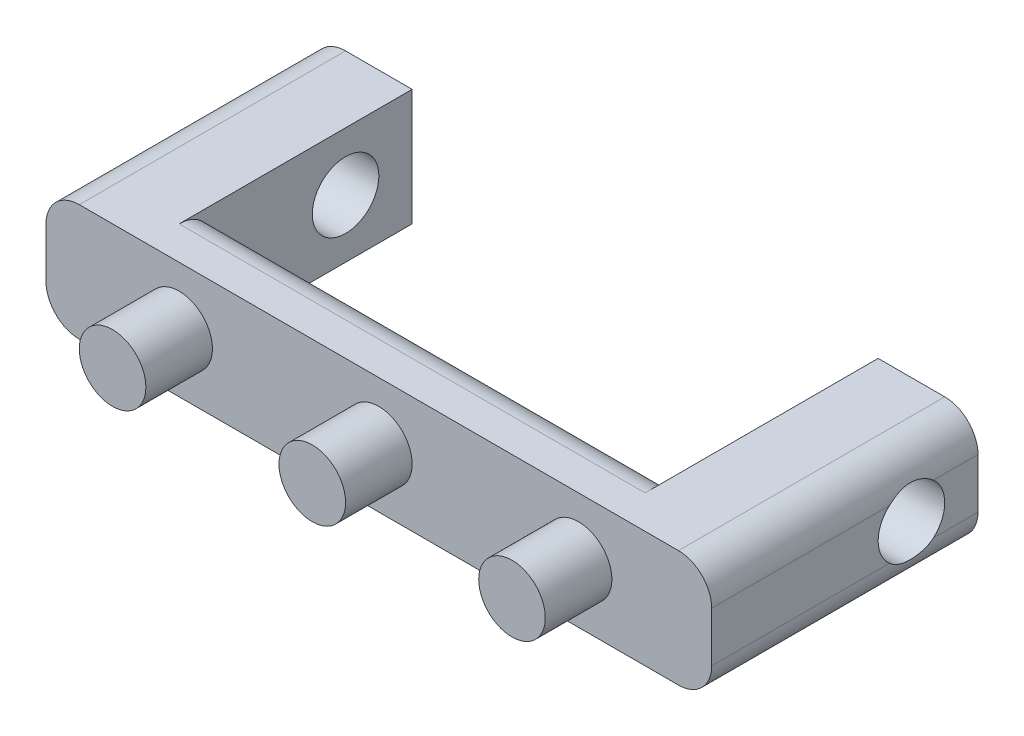
ISO-10303-21;
HEADER;
FILE_DESCRIPTION(('STEP AP214'),'2;1');
FILE_NAME('part.step','',(''),(''),'','','');
FILE_SCHEMA(('AUTOMOTIVE_DESIGN { 1 0 10303 214 1 1 1 1 }'));
ENDSEC;
DATA;
#1=APPLICATION_CONTEXT('core data for automotive mechanical design processes');
#2=APPLICATION_PROTOCOL_DEFINITION('international standard','automotive_design',2000,#1);
#3=PRODUCT_CONTEXT('',#1,'mechanical');
#4=PRODUCT('Part','Part','',(#3));
#5=PRODUCT_RELATED_PRODUCT_CATEGORY('part','',(#4));
#6=PRODUCT_DEFINITION_FORMATION('','',#4);
#7=PRODUCT_DEFINITION_CONTEXT('part definition',#1,'design');
#8=PRODUCT_DEFINITION('design','',#6,#7);
#9=PRODUCT_DEFINITION_SHAPE('','',#8);
#10=(LENGTH_UNIT() NAMED_UNIT(*) SI_UNIT(.MILLI.,.METRE.));
#11=(NAMED_UNIT(*) PLANE_ANGLE_UNIT() SI_UNIT($,.RADIAN.));
#12=(NAMED_UNIT(*) SI_UNIT($,.STERADIAN.) SOLID_ANGLE_UNIT());
#13=UNCERTAINTY_MEASURE_WITH_UNIT(LENGTH_MEASURE(1.E-05),#10,'distance_accuracy_value','');
#14=(GEOMETRIC_REPRESENTATION_CONTEXT(3) GLOBAL_UNCERTAINTY_ASSIGNED_CONTEXT((#13)) GLOBAL_UNIT_ASSIGNED_CONTEXT((#10,
#11,#12)) REPRESENTATION_CONTEXT('',''));
#15=CARTESIAN_POINT('',(0.,0.,0.));
#16=DIRECTION('',(0.,0.,1.));
#17=DIRECTION('',(1.,0.,0.));
#18=AXIS2_PLACEMENT_3D('',#15,#16,#17);
#19=CARTESIAN_POINT('',(10.,3.5,0.));
#20=DIRECTION('',(-1.,0.,0.));
#21=DIRECTION('',(0.,0.,1.));
#22=AXIS2_PLACEMENT_3D('',#19,#20,#21);
#23=PLANE('',#22);
#24=CARTESIAN_POINT('',(10.,1.75000000000125,-6.00000000000023));
#25=DIRECTION('',(1.,0.,0.));
#26=DIRECTION('',(0.,0.,-1.));
#27=AXIS2_PLACEMENT_3D('',#24,#25,#26);
#28=CIRCLE('',#27,1.);
#29=CARTESIAN_POINT('',(10.,1.,-6.66143782776495));
#30=VERTEX_POINT('',#29);
#31=CARTESIAN_POINT('',(9.99999999999995,2.5,-6.66143782776779));
#32=VERTEX_POINT('',#31);
#33=EDGE_CURVE('E53',#30,#32,#28,.T.);
#34=ORIENTED_EDGE('',*,*,#33,.F.);
#35=DIRECTION('',(0.,0.,-1.));
#36=VECTOR('',#35,1.);
#37=CARTESIAN_POINT('',(10.,1.,0.));
#38=LINE('',#37,#36);
#39=CARTESIAN_POINT('',(9.99999999999994,1.,-8.00000000000008));
#40=VERTEX_POINT('',#39);
#41=EDGE_CURVE('E185',#30,#40,#38,.T.);
#42=ORIENTED_EDGE('',*,*,#41,.T.);
#43=DIRECTION('',(0.,-1.,0.));
#44=VECTOR('',#43,1.);
#45=CARTESIAN_POINT('',(9.99999999999994,3.5,-8.00000000000008));
#46=LINE('',#45,#44);
#47=CARTESIAN_POINT('',(9.99999999999994,2.5,-8.00000000000008));
#48=VERTEX_POINT('',#47);
#49=EDGE_CURVE('E319',#48,#40,#46,.T.);
#50=ORIENTED_EDGE('',*,*,#49,.F.);
#51=DIRECTION('',(0.,0.,-1.));
#52=VECTOR('',#51,1.);
#53=CARTESIAN_POINT('',(10.,2.5,0.));
#54=LINE('',#53,#52);
#55=EDGE_CURVE('E182',#48,#32,#54,.F.);
#56=ORIENTED_EDGE('',*,*,#55,.T.);
#57=EDGE_LOOP('',(#34,#42,#50,#56));
#58=FACE_BOUND('',#57,.T.);
#59=ADVANCED_FACE('F32',(#58),#23,.F.);
#60=CARTESIAN_POINT('',(9.,1.,0.));
#61=DIRECTION('',(0.,0.,-1.));
#62=DIRECTION('',(-1.,0.,0.));
#63=AXIS2_PLACEMENT_3D('',#60,#61,#62);
#64=CYLINDRICAL_SURFACE('',#63,1.);
#65=ORIENTED_EDGE('',*,*,#41,.F.);
#66=CARTESIAN_POINT('',(9.99999999999996,1.,-6.66143782776496));
#67=CARTESIAN_POINT('',(9.99999832438322,0.981522059732604,-6.64048660112317));
#68=CARTESIAN_POINT('',(9.99948822286873,0.963937703865897,-6.61877652365661));
#69=CARTESIAN_POINT('',(9.99773266128897,0.930664287749962,-6.57399220271783));
#70=CARTESIAN_POINT('',(9.99648755521023,0.914974319520771,-6.55091862073546));
#71=CARTESIAN_POINT('',(9.99207262510002,0.870902549306813,-6.47988344997457));
#72=CARTESIAN_POINT('',(9.98822242331708,0.845493524574181,-6.4300786002302));
#73=CARTESIAN_POINT('',(9.98070472424984,0.803328622668677,-6.3269818689779));
#74=CARTESIAN_POINT('',(9.97703712474316,0.786567853774537,-6.27369197798079));
#75=CARTESIAN_POINT('',(9.97138167877748,0.762140487145189,-6.16501164766548));
#76=CARTESIAN_POINT('',(9.96939226256035,0.754465388036027,-6.10962322209779));
#77=CARTESIAN_POINT('',(9.9678512337407,0.748455512095464,-5.99842806915257));
#78=CARTESIAN_POINT('',(9.96829428760576,0.750100300355543,-5.94262252467018));
#79=CARTESIAN_POINT('',(9.97143991448417,0.762630547090218,-5.83207475013634));
#80=CARTESIAN_POINT('',(9.97414468442479,0.773524990413509,-5.77733360691789));
#81=CARTESIAN_POINT('',(9.98072638026525,0.80400699138556,-5.67119824458025));
#82=CARTESIAN_POINT('',(9.9845876899553,0.823480267611774,-5.61976988913162));
#83=CARTESIAN_POINT('',(9.9918735907906,0.87057722072228,-5.52082817967031));
#84=CARTESIAN_POINT('',(9.99529901844926,0.89818493818211,-5.47330739053007));
#85=CARTESIAN_POINT('',(9.99828008159416,0.940373042766359,-5.4127448210161));
#86=CARTESIAN_POINT('',(9.99890255034826,0.951706936562084,-5.39742898441933));
#87=CARTESIAN_POINT('',(9.99976220606906,0.975223282471342,-5.36747933223696));
#88=CARTESIAN_POINT('',(9.99999981234853,0.987404795974064,-5.35284479128442));
#89=CARTESIAN_POINT('',(9.99999999999996,1.,-5.3385621722355));
#90=B_SPLINE_CURVE_WITH_KNOTS('',3,(#66,#67,#68,#69,#70,#71,#72,#73,#74,#75,#76,#77,#78,#79,#80,
#81,#82,#83,#84,#85,#86,#87,#88,#89),.UNSPECIFIED.,.F.,.F.,(4,2,2,2,2,2,2,2,2,2,2,4),(0.,
0.0837388378141982,0.167437378920118,0.334720763890422,0.501909424186448,0.668941523695534,
0.835607528328991,1.0024356129903,1.1671055311355,1.33145450115712,1.38861817737812,
1.44571953102358),.UNSPECIFIED.);
#91=CARTESIAN_POINT('',(10.,1.,-5.3385621722355));
#92=VERTEX_POINT('',#91);
#93=EDGE_CURVE('E176',#30,#92,#90,.T.);
#94=ORIENTED_EDGE('',*,*,#93,.T.);
#95=CARTESIAN_POINT('',(10.,1.,0.));
#96=VERTEX_POINT('',#95);
#97=EDGE_CURVE('E175',#96,#92,#38,.T.);
#98=ORIENTED_EDGE('',*,*,#97,.F.);
#99=CARTESIAN_POINT('',(9.,1.,0.));
#100=DIRECTION('',(0.,0.,-1.));
#101=DIRECTION('',(-1.,0.,0.));
#102=AXIS2_PLACEMENT_3D('',#99,#100,#101);
#103=CIRCLE('',#102,1.);
#104=CARTESIAN_POINT('',(9.,0.,0.));
#105=VERTEX_POINT('',#104);
#106=EDGE_CURVE('E201',#105,#96,#103,.F.);
#107=ORIENTED_EDGE('',*,*,#106,.F.);
#108=DIRECTION('',(0.,0.,-1.));
#109=VECTOR('',#108,1.);
#110=CARTESIAN_POINT('',(9.,0.,0.));
#111=LINE('',#110,#109);
#112=CARTESIAN_POINT('',(8.99999999999994,0.,-8.00000000000007));
#113=VERTEX_POINT('',#112);
#114=EDGE_CURVE('E349',#113,#105,#111,.F.);
#115=ORIENTED_EDGE('',*,*,#114,.F.);
#116=CARTESIAN_POINT('',(8.99999999999994,1.,-8.00000000000007));
#117=DIRECTION('',(0.,0.,1.));
#118=DIRECTION('',(1.,0.,0.));
#119=AXIS2_PLACEMENT_3D('',#116,#117,#118);
#120=CIRCLE('',#119,1.);
#121=EDGE_CURVE('E194',#40,#113,#120,.F.);
#122=ORIENTED_EDGE('',*,*,#121,.F.);
#123=EDGE_LOOP('',(#65,#94,#98,#107,#115,#122));
#124=FACE_BOUND('',#123,.T.);
#125=ADVANCED_FACE('F256',(#124),#64,.T.);
#126=CARTESIAN_POINT('',(9.,2.5,0.));
#127=DIRECTION('',(0.,0.,1.));
#128=DIRECTION('',(1.,0.,0.));
#129=AXIS2_PLACEMENT_3D('',#126,#127,#128);
#130=CYLINDRICAL_SURFACE('',#129,1.);
#131=CARTESIAN_POINT('',(10.,2.5,-5.33856217223266));
#132=VERTEX_POINT('',#131);
#133=CARTESIAN_POINT('',(10.,2.5,0.));
#134=VERTEX_POINT('',#133);
#135=EDGE_CURVE('E172',#132,#134,#54,.F.);
#136=ORIENTED_EDGE('',*,*,#135,.F.);
#137=CARTESIAN_POINT('',(9.99999999999997,2.5,-5.33856217223266));
#138=CARTESIAN_POINT('',(9.99999832438323,2.51847794026747,-5.35951339887438));
#139=CARTESIAN_POINT('',(9.99948822286874,2.53606229613426,-5.38122347634086));
#140=CARTESIAN_POINT('',(9.99773266128896,2.56933571225036,-5.42600779727951));
#141=CARTESIAN_POINT('',(9.99648755521021,2.58502568047963,-5.44908137926182));
#142=CARTESIAN_POINT('',(9.99207262509994,2.62909745069385,-5.52011655002252));
#143=CARTESIAN_POINT('',(9.98822242331695,2.65450647542667,-5.56992139976678));
#144=CARTESIAN_POINT('',(9.9807047242496,2.69667137733256,-5.67301813101888));
#145=CARTESIAN_POINT('',(9.97703712474285,2.7134321462269,-5.72630802201591));
#146=CARTESIAN_POINT('',(9.97138167877703,2.73785951285666,-5.83498835233109));
#147=CARTESIAN_POINT('',(9.96939226255982,2.74553461196604,-5.89037677789874));
#148=CARTESIAN_POINT('',(9.96785123374004,2.75154448790704,-6.00157193084393));
#149=CARTESIAN_POINT('',(9.96829428760506,2.74989969964718,-6.05737747532633));
#150=CARTESIAN_POINT('',(9.9714399144834,2.73736945291294,-6.16792524986025));
#151=CARTESIAN_POINT('',(9.97414468442401,2.72647500958986,-6.22266639307874));
#152=CARTESIAN_POINT('',(9.98072638026448,2.69599300861824,-6.32880175541646));
#153=CARTESIAN_POINT('',(9.98458768995457,2.67651973239225,-6.38023011086512));
#154=CARTESIAN_POINT('',(9.99187359079001,2.62942277928219,-6.47917182032652));
#155=CARTESIAN_POINT('',(9.99529901844876,2.60181506182259,-6.52669260946682));
#156=CARTESIAN_POINT('',(9.99828008159391,2.55962695723786,-6.58725517898203));
#157=CARTESIAN_POINT('',(9.99890255034809,2.54829306344137,-6.60257101557989));
#158=CARTESIAN_POINT('',(9.99976220606902,2.52477671753047,-6.63252066776437));
#159=CARTESIAN_POINT('',(9.99999981234852,2.51259520402687,-6.64715520871791));
#160=CARTESIAN_POINT('',(9.99999999999996,2.5,-6.66143782776779));
#161=B_SPLINE_CURVE_WITH_KNOTS('',3,(#137,#138,#139,#140,#141,#142,#143,#144,#145,#146,#147,
#148,#149,#150,#151,#152,#153,#154,#155,#156,#157,#158,#159,#160),.UNSPECIFIED.,.F.,.F.,(4,2,2,
2,2,2,2,2,2,2,2,4),(0.,0.0837388378141815,0.167437378920086,0.334720763890355,0.501909424186341,
0.668941523695386,0.835607528328872,1.00243561299021,1.16710553113525,1.33145450115673,
1.38861817738174,1.4457195310312),.UNSPECIFIED.);
#162=EDGE_CURVE('E11',#132,#32,#161,.T.);
#163=ORIENTED_EDGE('',*,*,#162,.T.);
#164=ORIENTED_EDGE('',*,*,#55,.F.);
#165=CARTESIAN_POINT('',(8.99999999999994,2.5,-8.00000000000007));
#166=DIRECTION('',(0.,0.,1.));
#167=DIRECTION('',(1.,0.,0.));
#168=AXIS2_PLACEMENT_3D('',#165,#166,#167);
#169=CIRCLE('',#168,1.);
#170=CARTESIAN_POINT('',(8.99999999999994,3.5,-8.00000000000007));
#171=VERTEX_POINT('',#170);
#172=EDGE_CURVE('E192',#171,#48,#169,.F.);
#173=ORIENTED_EDGE('',*,*,#172,.F.);
#174=DIRECTION('',(0.,0.,-1.));
#175=VECTOR('',#174,1.);
#176=CARTESIAN_POINT('',(8.99999999999994,3.5,-8.00000000000007));
#177=LINE('',#176,#175);
#178=CARTESIAN_POINT('',(9.,3.5,0.));
#179=VERTEX_POINT('',#178);
#180=EDGE_CURVE('E187',#179,#171,#177,.T.);
#181=ORIENTED_EDGE('',*,*,#180,.F.);
#182=CARTESIAN_POINT('',(9.,2.5,0.));
#183=DIRECTION('',(0.,0.,-1.));
#184=DIRECTION('',(-1.,0.,0.));
#185=AXIS2_PLACEMENT_3D('',#182,#183,#184);
#186=CIRCLE('',#185,1.);
#187=EDGE_CURVE('E181',#134,#179,#186,.F.);
#188=ORIENTED_EDGE('',*,*,#187,.F.);
#189=EDGE_LOOP('',(#136,#163,#164,#173,#181,#188));
#190=FACE_BOUND('',#189,.T.);
#191=ADVANCED_FACE('F179',(#190),#130,.T.);
#192=CARTESIAN_POINT('',(-10.,3.5,0.));
#193=DIRECTION('',(1.,0.,0.));
#194=DIRECTION('',(0.,0.,-1.));
#195=AXIS2_PLACEMENT_3D('',#192,#193,#194);
#196=PLANE('',#195);
#197=DIRECTION('',(0.,0.,1.));
#198=VECTOR('',#197,1.);
#199=CARTESIAN_POINT('',(-10.,2.5,-8.));
#200=LINE('',#199,#198);
#201=CARTESIAN_POINT('',(-10.,2.5,0.));
#202=VERTEX_POINT('',#201);
#203=CARTESIAN_POINT('',(-10.,2.5,-5.33856217223266));
#204=VERTEX_POINT('',#203);
#205=EDGE_CURVE('E204',#202,#204,#200,.F.);
#206=ORIENTED_EDGE('',*,*,#205,.T.);
#207=CARTESIAN_POINT('',(-10.,1.75000000000125,-6.00000000000023));
#208=DIRECTION('',(1.,0.,0.));
#209=DIRECTION('',(0.,0.,-1.));
#210=AXIS2_PLACEMENT_3D('',#207,#208,#209);
#211=CIRCLE('',#210,1.);
#212=CARTESIAN_POINT('',(-10.,1.,-5.3385621722355));
#213=VERTEX_POINT('',#212);
#214=EDGE_CURVE('E60',#204,#213,#211,.T.);
#215=ORIENTED_EDGE('',*,*,#214,.T.);
#216=DIRECTION('',(0.,0.,1.));
#217=VECTOR('',#216,1.);
#218=CARTESIAN_POINT('',(-10.,1.,0.));
#219=LINE('',#218,#217);
#220=CARTESIAN_POINT('',(-10.,1.,0.));
#221=VERTEX_POINT('',#220);
#222=EDGE_CURVE('E207',#213,#221,#219,.T.);
#223=ORIENTED_EDGE('',*,*,#222,.T.);
#224=DIRECTION('',(0.,-1.,0.));
#225=VECTOR('',#224,1.);
#226=CARTESIAN_POINT('',(-10.,3.5,0.));
#227=LINE('',#226,#225);
#228=EDGE_CURVE('E325',#202,#221,#227,.T.);
#229=ORIENTED_EDGE('',*,*,#228,.F.);
#230=EDGE_LOOP('',(#206,#215,#223,#229));
#231=FACE_BOUND('',#230,.T.);
#232=ADVANCED_FACE('F255',(#231),#196,.F.);
#233=CARTESIAN_POINT('',(6.99999999999994,3.5,-8.00000000000005));
#234=DIRECTION('',(1.,0.,0.));
#235=DIRECTION('',(0.,0.,-1.));
#236=AXIS2_PLACEMENT_3D('',#233,#234,#235);
#237=PLANE('',#236);
#238=CARTESIAN_POINT('',(7.,1.75000000000125,-6.00000000000023));
#239=DIRECTION('',(1.,0.,0.));
#240=DIRECTION('',(0.,0.,-1.));
#241=AXIS2_PLACEMENT_3D('',#238,#239,#240);
#242=CIRCLE('',#241,1.);
#243=CARTESIAN_POINT('',(7.,1.75000000000125,-7.00000000000023));
#244=VERTEX_POINT('',#243);
#245=EDGE_CURVE('E267',#244,#244,#242,.T.);
#246=ORIENTED_EDGE('',*,*,#245,.T.);
#247=EDGE_LOOP('',(#246));
#248=FACE_BOUND('',#247,.T.);
#249=DIRECTION('',(0.,0.,1.));
#250=VECTOR('',#249,1.);
#251=CARTESIAN_POINT('',(6.99999999999994,0.,-8.00000000000005));
#252=LINE('',#251,#250);
#253=CARTESIAN_POINT('',(6.99999999999994,0.,-8.00000000000005));
#254=VERTEX_POINT('',#253);
#255=CARTESIAN_POINT('',(7.00000000000001,0.,-0.999999999999998));
#256=VERTEX_POINT('',#255);
#257=EDGE_CURVE('E293',#254,#256,#252,.T.);
#258=ORIENTED_EDGE('',*,*,#257,.T.);
#259=CARTESIAN_POINT('',(7.00000000000001,1.,-0.999999999999999));
#260=DIRECTION('',(1.,0.,0.));
#261=DIRECTION('',(0.,0.,-1.));
#262=AXIS2_PLACEMENT_3D('',#259,#260,#261);
#263=CIRCLE('',#262,1.);
#264=CARTESIAN_POINT('',(7.,1.,-2.));
#265=VERTEX_POINT('',#264);
#266=EDGE_CURVE('E218',#256,#265,#263,.T.);
#267=ORIENTED_EDGE('',*,*,#266,.T.);
#268=DIRECTION('',(0.,-1.,0.));
#269=VECTOR('',#268,1.);
#270=CARTESIAN_POINT('',(7.,3.5,-2.));
#271=LINE('',#270,#269);
#272=CARTESIAN_POINT('',(7.,2.5,-2.));
#273=VERTEX_POINT('',#272);
#274=EDGE_CURVE('E331',#273,#265,#271,.T.);
#275=ORIENTED_EDGE('',*,*,#274,.F.);
#276=CARTESIAN_POINT('',(7.00000000000001,2.5,-0.999999999999999));
#277=DIRECTION('',(1.,0.,0.));
#278=DIRECTION('',(0.,0.,-1.));
#279=AXIS2_PLACEMENT_3D('',#276,#277,#278);
#280=CIRCLE('',#279,1.);
#281=CARTESIAN_POINT('',(7.00000000000001,3.5,-0.999999999999998));
#282=VERTEX_POINT('',#281);
#283=EDGE_CURVE('E222',#273,#282,#280,.T.);
#284=ORIENTED_EDGE('',*,*,#283,.T.);
#285=DIRECTION('',(0.,0.,1.));
#286=VECTOR('',#285,1.);
#287=CARTESIAN_POINT('',(6.99999999999994,3.5,-8.00000000000005));
#288=LINE('',#287,#286);
#289=CARTESIAN_POINT('',(6.99999999999994,3.5,-8.00000000000005));
#290=VERTEX_POINT('',#289);
#291=EDGE_CURVE('E315',#290,#282,#288,.T.);
#292=ORIENTED_EDGE('',*,*,#291,.F.);
#293=DIRECTION('',(0.,-1.,0.));
#294=VECTOR('',#293,1.);
#295=CARTESIAN_POINT('',(6.99999999999994,3.5,-8.00000000000005));
#296=LINE('',#295,#294);
#297=EDGE_CURVE('E316',#290,#254,#296,.T.);
#298=ORIENTED_EDGE('',*,*,#297,.T.);
#299=EDGE_LOOP('',(#258,#267,#275,#284,#292,#298));
#300=FACE_BOUND('',#299,.T.);
#301=ADVANCED_FACE('F402',(#248,#300),#237,.F.);
#302=CARTESIAN_POINT('',(-7.,3.5,-2.));
#303=DIRECTION('',(0.,0.,1.));
#304=DIRECTION('',(1.,0.,0.));
#305=AXIS2_PLACEMENT_3D('',#302,#303,#304);
#306=PLANE('',#305);
#307=ORIENTED_EDGE('',*,*,#274,.T.);
#308=DIRECTION('',(-1.,0.,0.));
#309=VECTOR('',#308,1.);
#310=CARTESIAN_POINT('',(-7.,1.,-2.));
#311=LINE('',#310,#309);
#312=CARTESIAN_POINT('',(-7.,1.,-2.));
#313=VERTEX_POINT('',#312);
#314=EDGE_CURVE('E345',#265,#313,#311,.T.);
#315=ORIENTED_EDGE('',*,*,#314,.T.);
#316=DIRECTION('',(0.,-1.,0.));
#317=VECTOR('',#316,1.);
#318=CARTESIAN_POINT('',(-7.,3.5,-2.));
#319=LINE('',#318,#317);
#320=CARTESIAN_POINT('',(-7.,2.5,-2.));
#321=VERTEX_POINT('',#320);
#322=EDGE_CURVE('E300',#321,#313,#319,.T.);
#323=ORIENTED_EDGE('',*,*,#322,.F.);
#324=DIRECTION('',(-1.,0.,0.));
#325=VECTOR('',#324,1.);
#326=CARTESIAN_POINT('',(7.,2.5,-2.));
#327=LINE('',#326,#325);
#328=EDGE_CURVE('E343',#321,#273,#327,.F.);
#329=ORIENTED_EDGE('',*,*,#328,.T.);
#330=EDGE_LOOP('',(#307,#315,#323,#329));
#331=FACE_BOUND('',#330,.T.);
#332=ADVANCED_FACE('F280',(#331),#306,.F.);
#333=CARTESIAN_POINT('',(-7.,3.5,-8.));
#334=DIRECTION('',(-1.,0.,0.));
#335=DIRECTION('',(0.,0.,1.));
#336=AXIS2_PLACEMENT_3D('',#333,#334,#335);
#337=PLANE('',#336);
#338=CARTESIAN_POINT('',(-7.,1.75000000000125,-6.00000000000023));
#339=DIRECTION('',(1.,0.,0.));
#340=DIRECTION('',(0.,0.,-1.));
#341=AXIS2_PLACEMENT_3D('',#338,#339,#340);
#342=CIRCLE('',#341,1.);
#343=CARTESIAN_POINT('',(-7.,1.75000000000125,-7.00000000000023));
#344=VERTEX_POINT('',#343);
#345=EDGE_CURVE('E244',#344,#344,#342,.T.);
#346=ORIENTED_EDGE('',*,*,#345,.F.);
#347=EDGE_LOOP('',(#346));
#348=FACE_BOUND('',#347,.T.);
#349=DIRECTION('',(0.,0.,-1.));
#350=VECTOR('',#349,1.);
#351=CARTESIAN_POINT('',(-7.,0.,-8.));
#352=LINE('',#351,#350);
#353=CARTESIAN_POINT('',(-7.,0.,-0.999999999999999));
#354=VERTEX_POINT('',#353);
#355=CARTESIAN_POINT('',(-7.,0.,-8.));
#356=VERTEX_POINT('',#355);
#357=EDGE_CURVE('E283',#354,#356,#352,.T.);
#358=ORIENTED_EDGE('',*,*,#357,.T.);
#359=DIRECTION('',(0.,-1.,0.));
#360=VECTOR('',#359,1.);
#361=CARTESIAN_POINT('',(-7.,3.5,-8.));
#362=LINE('',#361,#360);
#363=CARTESIAN_POINT('',(-7.,3.5,-8.));
#364=VERTEX_POINT('',#363);
#365=EDGE_CURVE('E285',#364,#356,#362,.T.);
#366=ORIENTED_EDGE('',*,*,#365,.F.);
#367=DIRECTION('',(0.,0.,-1.));
#368=VECTOR('',#367,1.);
#369=CARTESIAN_POINT('',(-7.,3.5,-8.));
#370=LINE('',#369,#368);
#371=CARTESIAN_POINT('',(-7.,3.5,-0.999999999999999));
#372=VERTEX_POINT('',#371);
#373=EDGE_CURVE('E381',#372,#364,#370,.T.);
#374=ORIENTED_EDGE('',*,*,#373,.F.);
#375=CARTESIAN_POINT('',(-7.,2.5,-0.999999999999999));
#376=DIRECTION('',(-1.,0.,0.));
#377=DIRECTION('',(0.,0.,1.));
#378=AXIS2_PLACEMENT_3D('',#375,#376,#377);
#379=CIRCLE('',#378,1.);
#380=EDGE_CURVE('E220',#372,#321,#379,.T.);
#381=ORIENTED_EDGE('',*,*,#380,.T.);
#382=ORIENTED_EDGE('',*,*,#322,.T.);
#383=CARTESIAN_POINT('',(-7.,1.,-0.999999999999999));
#384=DIRECTION('',(-1.,0.,0.));
#385=DIRECTION('',(0.,0.,1.));
#386=AXIS2_PLACEMENT_3D('',#383,#384,#385);
#387=CIRCLE('',#386,1.);
#388=EDGE_CURVE('E215',#313,#354,#387,.T.);
#389=ORIENTED_EDGE('',*,*,#388,.T.);
#390=EDGE_LOOP('',(#358,#366,#374,#381,#382,#389));
#391=FACE_BOUND('',#390,.T.);
#392=ADVANCED_FACE('F276',(#348,#391),#337,.F.);
#393=CARTESIAN_POINT('',(-10.,3.5,-8.));
#394=DIRECTION('',(0.,0.,1.));
#395=DIRECTION('',(1.,0.,0.));
#396=AXIS2_PLACEMENT_3D('',#393,#394,#395);
#397=PLANE('',#396);
#398=DIRECTION('',(-1.,0.,0.));
#399=VECTOR('',#398,1.);
#400=CARTESIAN_POINT('',(-10.,0.,-8.));
#401=LINE('',#400,#399);
#402=CARTESIAN_POINT('',(-9.,0.,-8.));
#403=VERTEX_POINT('',#402);
#404=EDGE_CURVE('E292',#356,#403,#401,.T.);
#405=ORIENTED_EDGE('',*,*,#404,.T.);
#406=CARTESIAN_POINT('',(-9.,1.,-8.));
#407=DIRECTION('',(0.,0.,1.));
#408=DIRECTION('',(1.,0.,0.));
#409=AXIS2_PLACEMENT_3D('',#406,#407,#408);
#410=CIRCLE('',#409,1.);
#411=CARTESIAN_POINT('',(-10.,1.,-8.));
#412=VERTEX_POINT('',#411);
#413=EDGE_CURVE('E213',#403,#412,#410,.F.);
#414=ORIENTED_EDGE('',*,*,#413,.T.);
#415=DIRECTION('',(0.,-1.,0.));
#416=VECTOR('',#415,1.);
#417=CARTESIAN_POINT('',(-10.,3.5,-8.));
#418=LINE('',#417,#416);
#419=CARTESIAN_POINT('',(-10.,2.5,-8.));
#420=VERTEX_POINT('',#419);
#421=EDGE_CURVE('E301',#420,#412,#418,.T.);
#422=ORIENTED_EDGE('',*,*,#421,.F.);
#423=CARTESIAN_POINT('',(-9.,2.5,-8.));
#424=DIRECTION('',(0.,0.,1.));
#425=DIRECTION('',(1.,0.,0.));
#426=AXIS2_PLACEMENT_3D('',#423,#424,#425);
#427=CIRCLE('',#426,1.);
#428=CARTESIAN_POINT('',(-9.,3.5,-8.));
#429=VERTEX_POINT('',#428);
#430=EDGE_CURVE('E211',#420,#429,#427,.F.);
#431=ORIENTED_EDGE('',*,*,#430,.T.);
#432=DIRECTION('',(-1.,0.,0.));
#433=VECTOR('',#432,1.);
#434=CARTESIAN_POINT('',(-10.,3.5,-8.));
#435=LINE('',#434,#433);
#436=EDGE_CURVE('E299',#364,#429,#435,.T.);
#437=ORIENTED_EDGE('',*,*,#436,.F.);
#438=ORIENTED_EDGE('',*,*,#365,.T.);
#439=EDGE_LOOP('',(#405,#414,#422,#431,#437,#438));
#440=FACE_BOUND('',#439,.T.);
#441=ADVANCED_FACE('F279',(#440),#397,.F.);
#442=CARTESIAN_POINT('',(-10.,1.,-6.66143782776495));
#443=VERTEX_POINT('',#442);
#444=EDGE_CURVE('E208',#412,#443,#219,.T.);
#445=ORIENTED_EDGE('',*,*,#444,.T.);
#446=CARTESIAN_POINT('',(-10.,2.5,-6.66143782776779));
#447=VERTEX_POINT('',#446);
#448=EDGE_CURVE('E268',#443,#447,#211,.T.);
#449=ORIENTED_EDGE('',*,*,#448,.T.);
#450=EDGE_CURVE('E203',#447,#420,#200,.F.);
#451=ORIENTED_EDGE('',*,*,#450,.T.);
#452=ORIENTED_EDGE('',*,*,#421,.T.);
#453=EDGE_LOOP('',(#445,#449,#451,#452));
#454=FACE_BOUND('',#453,.T.);
#455=ADVANCED_FACE('F417',(#454),#196,.F.);
#456=CARTESIAN_POINT('',(10.,3.5,0.));
#457=DIRECTION('',(0.,0.,-1.));
#458=DIRECTION('',(-1.,0.,0.));
#459=AXIS2_PLACEMENT_3D('',#456,#457,#458);
#460=PLANE('',#459);
#461=CARTESIAN_POINT('',(5.99999999999836,1.74999999999352,0.));
#462=DIRECTION('',(0.,0.,-1.));
#463=DIRECTION('',(-1.,0.,0.));
#464=AXIS2_PLACEMENT_3D('',#461,#462,#463);
#465=CIRCLE('',#464,1.);
#466=CARTESIAN_POINT('',(4.99999999999835,1.74999999999352,0.));
#467=VERTEX_POINT('',#466);
#468=EDGE_CURVE('E340',#467,#467,#465,.F.);
#469=ORIENTED_EDGE('',*,*,#468,.F.);
#470=EDGE_LOOP('',(#469));
#471=FACE_BOUND('',#470,.T.);
#472=CARTESIAN_POINT('',(-5.99999999999837,1.74999999999352,0.));
#473=DIRECTION('',(0.,0.,-1.));
#474=DIRECTION('',(-1.,0.,0.));
#475=AXIS2_PLACEMENT_3D('',#472,#473,#474);
#476=CIRCLE('',#475,1.);
#477=CARTESIAN_POINT('',(-6.99999999999837,1.74999999999352,0.));
#478=VERTEX_POINT('',#477);
#479=EDGE_CURVE('E337',#478,#478,#476,.F.);
#480=ORIENTED_EDGE('',*,*,#479,.F.);
#481=EDGE_LOOP('',(#480));
#482=FACE_BOUND('',#481,.T.);
#483=CARTESIAN_POINT('',(0.,1.74999999999352,0.));
#484=DIRECTION('',(0.,0.,-1.));
#485=DIRECTION('',(-1.,0.,0.));
#486=AXIS2_PLACEMENT_3D('',#483,#484,#485);
#487=CIRCLE('',#486,1.);
#488=CARTESIAN_POINT('',(-1.,1.74999999999352,0.));
#489=VERTEX_POINT('',#488);
#490=EDGE_CURVE('E334',#489,#489,#487,.F.);
#491=ORIENTED_EDGE('',*,*,#490,.F.);
#492=EDGE_LOOP('',(#491));
#493=FACE_BOUND('',#492,.T.);
#494=DIRECTION('',(1.,0.,0.));
#495=VECTOR('',#494,1.);
#496=CARTESIAN_POINT('',(10.,0.,0.));
#497=LINE('',#496,#495);
#498=CARTESIAN_POINT('',(-9.,0.,0.));
#499=VERTEX_POINT('',#498);
#500=EDGE_CURVE('E307',#499,#105,#497,.T.);
#501=ORIENTED_EDGE('',*,*,#500,.T.);
#502=ORIENTED_EDGE('',*,*,#106,.T.);
#503=DIRECTION('',(0.,-1.,0.));
#504=VECTOR('',#503,1.);
#505=CARTESIAN_POINT('',(10.,3.5,0.));
#506=LINE('',#505,#504);
#507=EDGE_CURVE('E323',#134,#96,#506,.T.);
#508=ORIENTED_EDGE('',*,*,#507,.F.);
#509=ORIENTED_EDGE('',*,*,#187,.T.);
#510=DIRECTION('',(1.,0.,0.));
#511=VECTOR('',#510,1.);
#512=CARTESIAN_POINT('',(10.,3.5,0.));
#513=LINE('',#512,#511);
#514=CARTESIAN_POINT('',(-9.,3.5,0.));
#515=VERTEX_POINT('',#514);
#516=EDGE_CURVE('E362',#515,#179,#513,.T.);
#517=ORIENTED_EDGE('',*,*,#516,.F.);
#518=CARTESIAN_POINT('',(-9.,2.5,0.));
#519=DIRECTION('',(0.,0.,-1.));
#520=DIRECTION('',(-1.,0.,0.));
#521=AXIS2_PLACEMENT_3D('',#518,#519,#520);
#522=CIRCLE('',#521,1.);
#523=EDGE_CURVE('E196',#515,#202,#522,.F.);
#524=ORIENTED_EDGE('',*,*,#523,.T.);
#525=ORIENTED_EDGE('',*,*,#228,.T.);
#526=CARTESIAN_POINT('',(-9.,1.,0.));
#527=DIRECTION('',(0.,0.,-1.));
#528=DIRECTION('',(-1.,0.,0.));
#529=AXIS2_PLACEMENT_3D('',#526,#527,#528);
#530=CIRCLE('',#529,1.);
#531=EDGE_CURVE('E198',#221,#499,#530,.F.);
#532=ORIENTED_EDGE('',*,*,#531,.T.);
#533=EDGE_LOOP('',(#501,#502,#508,#509,#517,#524,#525,#532));
#534=FACE_BOUND('',#533,.T.);
#535=ADVANCED_FACE('F388',(#471,#482,#493,#534),#460,.F.);
#536=EDGE_CURVE('E162',#132,#92,#28,.T.);
#537=ORIENTED_EDGE('',*,*,#536,.F.);
#538=ORIENTED_EDGE('',*,*,#135,.T.);
#539=ORIENTED_EDGE('',*,*,#507,.T.);
#540=ORIENTED_EDGE('',*,*,#97,.T.);
#541=EDGE_LOOP('',(#537,#538,#539,#540));
#542=FACE_BOUND('',#541,.T.);
#543=ADVANCED_FACE('F170',(#542),#23,.F.);
#544=CARTESIAN_POINT('',(9.99999999999994,3.5,-8.00000000000008));
#545=DIRECTION('',(0.,0.,1.));
#546=DIRECTION('',(1.,0.,0.));
#547=AXIS2_PLACEMENT_3D('',#544,#545,#546);
#548=PLANE('',#547);
#549=ORIENTED_EDGE('',*,*,#49,.T.);
#550=ORIENTED_EDGE('',*,*,#121,.T.);
#551=DIRECTION('',(-1.,0.,0.));
#552=VECTOR('',#551,1.);
#553=CARTESIAN_POINT('',(9.99999999999994,0.,-8.00000000000008));
#554=LINE('',#553,#552);
#555=EDGE_CURVE('E310',#113,#254,#554,.T.);
#556=ORIENTED_EDGE('',*,*,#555,.T.);
#557=ORIENTED_EDGE('',*,*,#297,.F.);
#558=DIRECTION('',(-1.,0.,0.));
#559=VECTOR('',#558,1.);
#560=CARTESIAN_POINT('',(9.99999999999994,3.5,-8.00000000000008));
#561=LINE('',#560,#559);
#562=EDGE_CURVE('E320',#171,#290,#561,.T.);
#563=ORIENTED_EDGE('',*,*,#562,.F.);
#564=ORIENTED_EDGE('',*,*,#172,.T.);
#565=EDGE_LOOP('',(#549,#550,#556,#557,#563,#564));
#566=FACE_BOUND('',#565,.T.);
#567=ADVANCED_FACE('F364',(#566),#548,.F.);
#568=CARTESIAN_POINT('',(0.,3.5,0.));
#569=DIRECTION('',(0.,1.,0.));
#570=DIRECTION('',(0.,0.,1.));
#571=AXIS2_PLACEMENT_3D('',#568,#569,#570);
#572=PLANE('',#571);
#573=DIRECTION('',(-1.,0.,0.));
#574=VECTOR('',#573,1.);
#575=CARTESIAN_POINT('',(-7.,3.5,-0.999999999999999));
#576=LINE('',#575,#574);
#577=EDGE_CURVE('E183',#282,#372,#576,.T.);
#578=ORIENTED_EDGE('',*,*,#577,.T.);
#579=ORIENTED_EDGE('',*,*,#373,.T.);
#580=ORIENTED_EDGE('',*,*,#436,.T.);
#581=DIRECTION('',(0.,0.,1.));
#582=VECTOR('',#581,1.);
#583=CARTESIAN_POINT('',(-9.,3.5,0.));
#584=LINE('',#583,#582);
#585=EDGE_CURVE('E353',#429,#515,#584,.T.);
#586=ORIENTED_EDGE('',*,*,#585,.T.);
#587=ORIENTED_EDGE('',*,*,#516,.T.);
#588=ORIENTED_EDGE('',*,*,#180,.T.);
#589=ORIENTED_EDGE('',*,*,#562,.T.);
#590=ORIENTED_EDGE('',*,*,#291,.T.);
#591=EDGE_LOOP('',(#578,#579,#580,#586,#587,#588,#589,#590));
#592=FACE_BOUND('',#591,.T.);
#593=ADVANCED_FACE('F359',(#592),#572,.T.);
#594=CARTESIAN_POINT('',(0.,0.,0.));
#595=DIRECTION('',(0.,1.,0.));
#596=DIRECTION('',(0.,0.,1.));
#597=AXIS2_PLACEMENT_3D('',#594,#595,#596);
#598=PLANE('',#597);
#599=ORIENTED_EDGE('',*,*,#357,.F.);
#600=DIRECTION('',(-1.,0.,0.));
#601=VECTOR('',#600,1.);
#602=CARTESIAN_POINT('',(0.,0.,-0.999999999999999));
#603=LINE('',#602,#601);
#604=EDGE_CURVE('E351',#354,#256,#603,.F.);
#605=ORIENTED_EDGE('',*,*,#604,.T.);
#606=ORIENTED_EDGE('',*,*,#257,.F.);
#607=ORIENTED_EDGE('',*,*,#555,.F.);
#608=ORIENTED_EDGE('',*,*,#114,.T.);
#609=ORIENTED_EDGE('',*,*,#500,.F.);
#610=DIRECTION('',(0.,0.,1.));
#611=VECTOR('',#610,1.);
#612=CARTESIAN_POINT('',(-9.,0.,0.));
#613=LINE('',#612,#611);
#614=EDGE_CURVE('E306',#499,#403,#613,.F.);
#615=ORIENTED_EDGE('',*,*,#614,.T.);
#616=ORIENTED_EDGE('',*,*,#404,.F.);
#617=EDGE_LOOP('',(#599,#605,#606,#607,#608,#609,#615,#616));
#618=FACE_BOUND('',#617,.T.);
#619=ADVANCED_FACE('F303',(#618),#598,.F.);
#620=CARTESIAN_POINT('',(0.,1.74999999999352,2.));
#621=DIRECTION('',(0.,0.,-1.));
#622=DIRECTION('',(-1.,0.,0.));
#623=AXIS2_PLACEMENT_3D('',#620,#621,#622);
#624=CYLINDRICAL_SURFACE('',#623,1.);
#625=CARTESIAN_POINT('',(0.,1.74999999999352,2.));
#626=DIRECTION('',(0.,0.,1.));
#627=DIRECTION('',(1.,0.,0.));
#628=AXIS2_PLACEMENT_3D('',#625,#626,#627);
#629=CIRCLE('',#628,1.);
#630=CARTESIAN_POINT('',(0.999999999999997,1.74999999999352,2.));
#631=VERTEX_POINT('',#630);
#632=EDGE_CURVE('E370',#631,#631,#629,.T.);
#633=ORIENTED_EDGE('',*,*,#632,.F.);
#634=EDGE_LOOP('',(#633));
#635=FACE_BOUND('',#634,.T.);
#636=ORIENTED_EDGE('',*,*,#490,.T.);
#637=EDGE_LOOP('',(#636));
#638=FACE_BOUND('',#637,.T.);
#639=ADVANCED_FACE('F471',(#635,#638),#624,.T.);
#640=CARTESIAN_POINT('',(0.,1.74999999999352,2.));
#641=DIRECTION('',(0.,0.,1.));
#642=DIRECTION('',(1.,0.,0.));
#643=AXIS2_PLACEMENT_3D('',#640,#641,#642);
#644=PLANE('',#643);
#645=ORIENTED_EDGE('',*,*,#632,.T.);
#646=EDGE_LOOP('',(#645));
#647=FACE_BOUND('',#646,.T.);
#648=ADVANCED_FACE('F467',(#647),#644,.T.);
#649=CARTESIAN_POINT('',(-5.99999999999837,1.74999999999352,2.));
#650=DIRECTION('',(0.,0.,-1.));
#651=DIRECTION('',(-1.,0.,0.));
#652=AXIS2_PLACEMENT_3D('',#649,#650,#651);
#653=CYLINDRICAL_SURFACE('',#652,1.);
#654=CARTESIAN_POINT('',(-5.99999999999837,1.74999999999352,2.));
#655=DIRECTION('',(0.,0.,1.));
#656=DIRECTION('',(1.,0.,0.));
#657=AXIS2_PLACEMENT_3D('',#654,#655,#656);
#658=CIRCLE('',#657,1.);
#659=CARTESIAN_POINT('',(-4.99999999999837,1.74999999999352,2.));
#660=VERTEX_POINT('',#659);
#661=EDGE_CURVE('E374',#660,#660,#658,.T.);
#662=ORIENTED_EDGE('',*,*,#661,.F.);
#663=EDGE_LOOP('',(#662));
#664=FACE_BOUND('',#663,.T.);
#665=ORIENTED_EDGE('',*,*,#479,.T.);
#666=EDGE_LOOP('',(#665));
#667=FACE_BOUND('',#666,.T.);
#668=ADVANCED_FACE('F461',(#664,#667),#653,.T.);
#669=CARTESIAN_POINT('',(-5.99999999999837,1.74999999999352,2.));
#670=DIRECTION('',(0.,0.,1.));
#671=DIRECTION('',(1.,0.,0.));
#672=AXIS2_PLACEMENT_3D('',#669,#670,#671);
#673=PLANE('',#672);
#674=ORIENTED_EDGE('',*,*,#661,.T.);
#675=EDGE_LOOP('',(#674));
#676=FACE_BOUND('',#675,.T.);
#677=ADVANCED_FACE('F453',(#676),#673,.T.);
#678=CARTESIAN_POINT('',(5.99999999999836,1.74999999999352,2.));
#679=DIRECTION('',(0.,0.,-1.));
#680=DIRECTION('',(-1.,0.,0.));
#681=AXIS2_PLACEMENT_3D('',#678,#679,#680);
#682=CYLINDRICAL_SURFACE('',#681,1.);
#683=CARTESIAN_POINT('',(5.99999999999836,1.74999999999352,2.));
#684=DIRECTION('',(0.,0.,1.));
#685=DIRECTION('',(-1.,0.,0.));
#686=AXIS2_PLACEMENT_3D('',#683,#684,#685);
#687=CIRCLE('',#686,1.);
#688=CARTESIAN_POINT('',(4.99999999999835,1.74999999999352,2.));
#689=VERTEX_POINT('',#688);
#690=EDGE_CURVE('E243',#689,#689,#687,.T.);
#691=ORIENTED_EDGE('',*,*,#690,.F.);
#692=EDGE_LOOP('',(#691));
#693=FACE_BOUND('',#692,.T.);
#694=ORIENTED_EDGE('',*,*,#468,.T.);
#695=EDGE_LOOP('',(#694));
#696=FACE_BOUND('',#695,.T.);
#697=ADVANCED_FACE('F440',(#693,#696),#682,.T.);
#698=CARTESIAN_POINT('',(5.99999999999836,1.74999999999352,2.));
#699=DIRECTION('',(0.,0.,-1.));
#700=DIRECTION('',(-1.,0.,0.));
#701=AXIS2_PLACEMENT_3D('',#698,#699,#700);
#702=PLANE('',#701);
#703=ORIENTED_EDGE('',*,*,#690,.T.);
#704=EDGE_LOOP('',(#703));
#705=FACE_BOUND('',#704,.T.);
#706=ADVANCED_FACE('F233',(#705),#702,.F.);
#707=CARTESIAN_POINT('',(-7.,1.,-0.999999999999999));
#708=DIRECTION('',(-1.,0.,0.));
#709=DIRECTION('',(0.,0.,1.));
#710=AXIS2_PLACEMENT_3D('',#707,#708,#709);
#711=CYLINDRICAL_SURFACE('',#710,1.);
#712=ORIENTED_EDGE('',*,*,#266,.F.);
#713=ORIENTED_EDGE('',*,*,#604,.F.);
#714=ORIENTED_EDGE('',*,*,#388,.F.);
#715=ORIENTED_EDGE('',*,*,#314,.F.);
#716=EDGE_LOOP('',(#712,#713,#714,#715));
#717=FACE_BOUND('',#716,.T.);
#718=ADVANCED_FACE('F432',(#717),#711,.T.);
#719=CARTESIAN_POINT('',(0.,2.5,-0.999999999999999));
#720=DIRECTION('',(1.,0.,0.));
#721=DIRECTION('',(0.,0.,-1.));
#722=AXIS2_PLACEMENT_3D('',#719,#720,#721);
#723=CYLINDRICAL_SURFACE('',#722,1.);
#724=ORIENTED_EDGE('',*,*,#283,.F.);
#725=ORIENTED_EDGE('',*,*,#328,.F.);
#726=ORIENTED_EDGE('',*,*,#380,.F.);
#727=ORIENTED_EDGE('',*,*,#577,.F.);
#728=EDGE_LOOP('',(#724,#725,#726,#727));
#729=FACE_BOUND('',#728,.T.);
#730=ADVANCED_FACE('F250',(#729),#723,.T.);
#731=CARTESIAN_POINT('',(-9.,1.,0.));
#732=DIRECTION('',(0.,0.,1.));
#733=DIRECTION('',(1.,0.,0.));
#734=AXIS2_PLACEMENT_3D('',#731,#732,#733);
#735=CYLINDRICAL_SURFACE('',#734,1.);
#736=CARTESIAN_POINT('',(-10.,1.,-6.66143782776496));
#737=CARTESIAN_POINT('',(-9.99999832438327,0.981522059732604,-6.64048660112317));
#738=CARTESIAN_POINT('',(-9.99948822286878,0.963937703865897,-6.61877652365661));
#739=CARTESIAN_POINT('',(-9.99773266128902,0.930664287749962,-6.57399220271783));
#740=CARTESIAN_POINT('',(-9.99648755521028,0.914974319520771,-6.55091862073546));
#741=CARTESIAN_POINT('',(-9.99207262510006,0.870902549306813,-6.47988344997457));
#742=CARTESIAN_POINT('',(-9.98822242331712,0.845493524574181,-6.4300786002302));
#743=CARTESIAN_POINT('',(-9.98070472424989,0.803328622668678,-6.3269818689779));
#744=CARTESIAN_POINT('',(-9.97703712474321,0.786567853774538,-6.27369197798079));
#745=CARTESIAN_POINT('',(-9.97138167877752,0.762140487145189,-6.16501164766548));
#746=CARTESIAN_POINT('',(-9.96939226256039,0.754465388036027,-6.10962322209779));
#747=CARTESIAN_POINT('',(-9.96785123374074,0.748455512095465,-5.99842806915257));
#748=CARTESIAN_POINT('',(-9.9682942876058,0.750100300355543,-5.94262252467018));
#749=CARTESIAN_POINT('',(-9.97143991448421,0.762630547090218,-5.83207475013634));
#750=CARTESIAN_POINT('',(-9.97414468442484,0.773524990413508,-5.77733360691789));
#751=CARTESIAN_POINT('',(-9.98072638026529,0.80400699138556,-5.67119824458025));
#752=CARTESIAN_POINT('',(-9.98458768995533,0.823480267611773,-5.61976988913162));
#753=CARTESIAN_POINT('',(-9.99187359079064,0.870577220722279,-5.52082817967031));
#754=CARTESIAN_POINT('',(-9.99529901844929,0.898184938182109,-5.47330739053008));
#755=CARTESIAN_POINT('',(-9.9982800815942,0.940373042766358,-5.4127448210161));
#756=CARTESIAN_POINT('',(-9.99890255034829,0.951706936562083,-5.39742898441933));
#757=CARTESIAN_POINT('',(-9.9997622060691,0.975223282471342,-5.36747933223696));
#758=CARTESIAN_POINT('',(-9.99999981234856,0.987404795974064,-5.35284479128442));
#759=CARTESIAN_POINT('',(-10.,1.,-5.3385621722355));
#760=B_SPLINE_CURVE_WITH_KNOTS('',3,(#736,#737,#738,#739,#740,#741,#742,#743,#744,#745,#746,
#747,#748,#749,#750,#751,#752,#753,#754,#755,#756,#757,#758,#759),.UNSPECIFIED.,.F.,.F.,(4,2,2,
2,2,2,2,2,2,2,2,4),(0.,0.0837388378141983,0.167437378920118,0.334720763890422,0.501909424186447,
0.668941523695533,0.835607528328989,1.0024356129903,1.16710553113549,1.33145450115712,
1.38861817737812,1.44571953102358),.UNSPECIFIED.);
#761=EDGE_CURVE('E237',#443,#213,#760,.T.);
#762=ORIENTED_EDGE('',*,*,#761,.F.);
#763=ORIENTED_EDGE('',*,*,#444,.F.);
#764=ORIENTED_EDGE('',*,*,#413,.F.);
#765=ORIENTED_EDGE('',*,*,#614,.F.);
#766=ORIENTED_EDGE('',*,*,#531,.F.);
#767=ORIENTED_EDGE('',*,*,#222,.F.);
#768=EDGE_LOOP('',(#762,#763,#764,#765,#766,#767));
#769=FACE_BOUND('',#768,.T.);
#770=ADVANCED_FACE('F247',(#769),#735,.T.);
#771=CARTESIAN_POINT('',(-9.,2.5,0.));
#772=DIRECTION('',(0.,0.,-1.));
#773=DIRECTION('',(-1.,0.,0.));
#774=AXIS2_PLACEMENT_3D('',#771,#772,#773);
#775=CYLINDRICAL_SURFACE('',#774,1.);
#776=CARTESIAN_POINT('',(-10.,2.5,-5.33856217223266));
#777=CARTESIAN_POINT('',(-9.99999832438327,2.51847794026747,-5.35951339887438));
#778=CARTESIAN_POINT('',(-9.99948822286878,2.53606229613426,-5.38122347634086));
#779=CARTESIAN_POINT('',(-9.997732661289,2.56933571225036,-5.42600779727951));
#780=CARTESIAN_POINT('',(-9.99648755521025,2.58502568047963,-5.44908137926182));
#781=CARTESIAN_POINT('',(-9.99207262509998,2.62909745069385,-5.52011655002252));
#782=CARTESIAN_POINT('',(-9.98822242331699,2.65450647542667,-5.56992139976678));
#783=CARTESIAN_POINT('',(-9.98070472424964,2.69667137733256,-5.67301813101888));
#784=CARTESIAN_POINT('',(-9.97703712474289,2.7134321462269,-5.72630802201591));
#785=CARTESIAN_POINT('',(-9.97138167877707,2.73785951285666,-5.8349883523311));
#786=CARTESIAN_POINT('',(-9.96939226255986,2.74553461196604,-5.89037677789874));
#787=CARTESIAN_POINT('',(-9.96785123374009,2.75154448790704,-6.00157193084393));
#788=CARTESIAN_POINT('',(-9.9682942876051,2.74989969964719,-6.05737747532634));
#789=CARTESIAN_POINT('',(-9.97143991448344,2.73736945291294,-6.16792524986025));
#790=CARTESIAN_POINT('',(-9.97414468442405,2.72647500958986,-6.22266639307874));
#791=CARTESIAN_POINT('',(-9.98072638026453,2.69599300861824,-6.32880175541646));
#792=CARTESIAN_POINT('',(-9.98458768995461,2.67651973239225,-6.38023011086512));
#793=CARTESIAN_POINT('',(-9.99187359079005,2.62942277928219,-6.47917182032652));
#794=CARTESIAN_POINT('',(-9.9952990184488,2.60181506182259,-6.52669260946682));
#795=CARTESIAN_POINT('',(-9.99828008159395,2.55962695723786,-6.58725517898203));
#796=CARTESIAN_POINT('',(-9.99890255034813,2.54829306344137,-6.60257101557989));
#797=CARTESIAN_POINT('',(-9.99976220606906,2.52477671753047,-6.63252066776437));
#798=CARTESIAN_POINT('',(-9.99999981234856,2.51259520402687,-6.64715520871791));
#799=CARTESIAN_POINT('',(-10.,2.5,-6.66143782776779));
#800=B_SPLINE_CURVE_WITH_KNOTS('',3,(#776,#777,#778,#779,#780,#781,#782,#783,#784,#785,#786,
#787,#788,#789,#790,#791,#792,#793,#794,#795,#796,#797,#798,#799),.UNSPECIFIED.,.F.,.F.,(4,2,2,
2,2,2,2,2,2,2,2,4),(0.,0.0837388378141834,0.167437378920087,0.334720763890355,0.501909424186341,
0.668941523695386,0.835607528328874,1.00243561299021,1.16710553113525,1.33145450115673,
1.38861817738174,1.4457195310312),.UNSPECIFIED.);
#801=EDGE_CURVE('E46',#204,#447,#800,.T.);
#802=ORIENTED_EDGE('',*,*,#801,.F.);
#803=ORIENTED_EDGE('',*,*,#205,.F.);
#804=ORIENTED_EDGE('',*,*,#523,.F.);
#805=ORIENTED_EDGE('',*,*,#585,.F.);
#806=ORIENTED_EDGE('',*,*,#430,.F.);
#807=ORIENTED_EDGE('',*,*,#450,.F.);
#808=EDGE_LOOP('',(#802,#803,#804,#805,#806,#807));
#809=FACE_BOUND('',#808,.T.);
#810=ADVANCED_FACE('F34',(#809),#775,.T.);
#811=CARTESIAN_POINT('',(-10.,1.75000000000125,-6.00000000000023));
#812=DIRECTION('',(1.,0.,0.));
#813=DIRECTION('',(0.,0.,-1.));
#814=AXIS2_PLACEMENT_3D('',#811,#812,#813);
#815=CYLINDRICAL_SURFACE('',#814,1.);
#816=ORIENTED_EDGE('',*,*,#761,.T.);
#817=ORIENTED_EDGE('',*,*,#214,.F.);
#818=ORIENTED_EDGE('',*,*,#801,.T.);
#819=ORIENTED_EDGE('',*,*,#448,.F.);
#820=EDGE_LOOP('',(#816,#817,#818,#819));
#821=FACE_BOUND('',#820,.T.);
#822=ORIENTED_EDGE('',*,*,#345,.T.);
#823=EDGE_LOOP('',(#822));
#824=FACE_BOUND('',#823,.T.);
#825=ADVANCED_FACE('F228',(#821,#824),#815,.F.);
#826=CARTESIAN_POINT('',(10.,1.75000000000125,-6.00000000000023));
#827=DIRECTION('',(-1.,0.,0.));
#828=DIRECTION('',(0.,0.,1.));
#829=AXIS2_PLACEMENT_3D('',#826,#827,#828);
#830=CYLINDRICAL_SURFACE('',#829,1.);
#831=ORIENTED_EDGE('',*,*,#33,.T.);
#832=ORIENTED_EDGE('',*,*,#162,.F.);
#833=ORIENTED_EDGE('',*,*,#536,.T.);
#834=ORIENTED_EDGE('',*,*,#93,.F.);
#835=EDGE_LOOP('',(#831,#832,#833,#834));
#836=FACE_BOUND('',#835,.T.);
#837=ORIENTED_EDGE('',*,*,#245,.F.);
#838=EDGE_LOOP('',(#837));
#839=FACE_BOUND('',#838,.T.);
#840=ADVANCED_FACE('F160',(#836,#839),#830,.F.);
#841=CLOSED_SHELL('',(#59,#125,#191,#232,#301,#332,#392,#441,#455,#535,#543,#567,#593,#619,#639,
#648,#668,#677,#697,#706,#718,#730,#770,#810,#825,#840));
#842=MANIFOLD_SOLID_BREP('B2',#841);
#843=ADVANCED_BREP_SHAPE_REPRESENTATION('',(#18,#842),#14);
#844=SHAPE_DEFINITION_REPRESENTATION(#9,#843);
ENDSEC;
END-ISO-10303-21;
